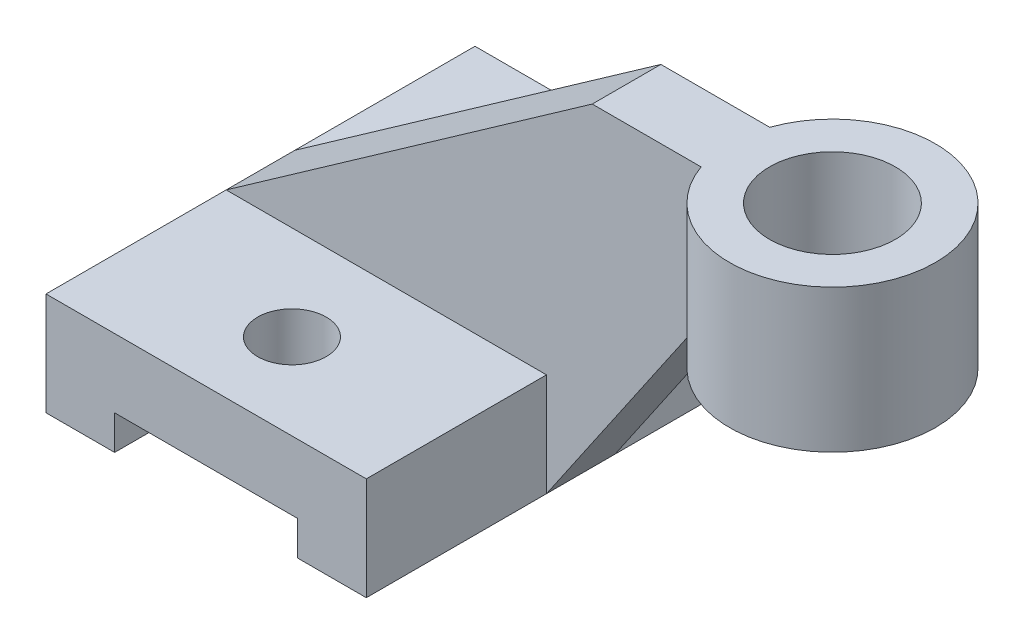
ISO-10303-21;
HEADER;
FILE_DESCRIPTION(('STEP AP214'),'2;1');
FILE_NAME('part.step','',(''),(''),'','','');
FILE_SCHEMA(('AUTOMOTIVE_DESIGN { 1 0 10303 214 1 1 1 1 }'));
ENDSEC;
DATA;
#1=APPLICATION_CONTEXT('core data for automotive mechanical design processes');
#2=APPLICATION_PROTOCOL_DEFINITION('international standard','automotive_design',2000,#1);
#3=PRODUCT_CONTEXT('',#1,'mechanical');
#4=PRODUCT('Part','Part','',(#3));
#5=PRODUCT_RELATED_PRODUCT_CATEGORY('part','',(#4));
#6=PRODUCT_DEFINITION_FORMATION('','',#4);
#7=PRODUCT_DEFINITION_CONTEXT('part definition',#1,'design');
#8=PRODUCT_DEFINITION('design','',#6,#7);
#9=PRODUCT_DEFINITION_SHAPE('','',#8);
#10=(LENGTH_UNIT() NAMED_UNIT(*) SI_UNIT(.MILLI.,.METRE.));
#11=(NAMED_UNIT(*) PLANE_ANGLE_UNIT() SI_UNIT($,.RADIAN.));
#12=(NAMED_UNIT(*) SI_UNIT($,.STERADIAN.) SOLID_ANGLE_UNIT());
#13=UNCERTAINTY_MEASURE_WITH_UNIT(LENGTH_MEASURE(1.E-05),#10,'distance_accuracy_value','');
#14=(GEOMETRIC_REPRESENTATION_CONTEXT(3) GLOBAL_UNCERTAINTY_ASSIGNED_CONTEXT((#13)) GLOBAL_UNIT_ASSIGNED_CONTEXT((#10,
#11,#12)) REPRESENTATION_CONTEXT('',''));
#15=CARTESIAN_POINT('',(0.,0.,0.));
#16=DIRECTION('',(0.,0.,1.));
#17=DIRECTION('',(1.,0.,0.));
#18=AXIS2_PLACEMENT_3D('',#15,#16,#17);
#19=CARTESIAN_POINT('',(56.,18.,-75.));
#20=DIRECTION('',(0.,1.,0.));
#21=DIRECTION('',(-1.,0.,0.));
#22=AXIS2_PLACEMENT_3D('',#19,#20,#21);
#23=PLANE('',#22);
#24=CARTESIAN_POINT('',(28.,18.,-60.));
#25=DIRECTION('',(0.,1.,0.));
#26=DIRECTION('',(-1.,0.,0.));
#27=AXIS2_PLACEMENT_3D('',#24,#25,#26);
#28=CIRCLE('',#27,6.);
#29=CARTESIAN_POINT('',(22.,18.,-60.));
#30=VERTEX_POINT('',#29);
#31=EDGE_CURVE('E217',#30,#30,#28,.T.);
#32=ORIENTED_EDGE('',*,*,#31,.F.);
#33=EDGE_LOOP('',(#32));
#34=FACE_BOUND('',#33,.T.);
#35=DIRECTION('',(0.,0.,1.));
#36=VECTOR('',#35,1.);
#37=CARTESIAN_POINT('',(0.,18.,-75.));
#38=LINE('',#37,#36);
#39=CARTESIAN_POINT('',(0.,18.,-75.));
#40=VERTEX_POINT('',#39);
#41=CARTESIAN_POINT('',(0.,18.,-43.5));
#42=VERTEX_POINT('',#41);
#43=EDGE_CURVE('E54',#40,#42,#38,.T.);
#44=ORIENTED_EDGE('',*,*,#43,.T.);
#45=DIRECTION('',(1.,0.,0.));
#46=VECTOR('',#45,1.);
#47=CARTESIAN_POINT('',(56.,18.,-43.5));
#48=LINE('',#47,#46);
#49=CARTESIAN_POINT('',(56.,18.,-43.5));
#50=VERTEX_POINT('',#49);
#51=EDGE_CURVE('E168',#42,#50,#48,.T.);
#52=ORIENTED_EDGE('',*,*,#51,.T.);
#53=DIRECTION('',(0.,0.,1.));
#54=VECTOR('',#53,1.);
#55=CARTESIAN_POINT('',(56.,18.,-75.));
#56=LINE('',#55,#54);
#57=CARTESIAN_POINT('',(56.,18.,-75.));
#58=VERTEX_POINT('',#57);
#59=EDGE_CURVE('E296',#58,#50,#56,.T.);
#60=ORIENTED_EDGE('',*,*,#59,.F.);
#61=DIRECTION('',(-1.,0.,0.));
#62=VECTOR('',#61,1.);
#63=CARTESIAN_POINT('',(56.,18.,-75.));
#64=LINE('',#63,#62);
#65=EDGE_CURVE('E255',#58,#40,#64,.T.);
#66=ORIENTED_EDGE('',*,*,#65,.T.);
#67=EDGE_LOOP('',(#44,#52,#60,#66));
#68=FACE_BOUND('',#67,.T.);
#69=ADVANCED_FACE('F45',(#34,#68),#23,.T.);
#70=CARTESIAN_POINT('',(56.,0.,-75.));
#71=DIRECTION('',(1.,0.,0.));
#72=DIRECTION('',(0.,0.,-1.));
#73=AXIS2_PLACEMENT_3D('',#70,#71,#72);
#74=PLANE('',#73);
#75=ORIENTED_EDGE('',*,*,#59,.T.);
#76=DIRECTION('',(0.,-1.,0.));
#77=VECTOR('',#76,1.);
#78=CARTESIAN_POINT('',(56.,0.,-43.5));
#79=LINE('',#78,#77);
#80=CARTESIAN_POINT('',(56.,0.,-43.5));
#81=VERTEX_POINT('',#80);
#82=EDGE_CURVE('E187',#50,#81,#79,.T.);
#83=ORIENTED_EDGE('',*,*,#82,.T.);
#84=DIRECTION('',(0.,0.,1.));
#85=VECTOR('',#84,1.);
#86=CARTESIAN_POINT('',(56.,0.,-75.));
#87=LINE('',#86,#85);
#88=CARTESIAN_POINT('',(56.,0.,-75.));
#89=VERTEX_POINT('',#88);
#90=EDGE_CURVE('E301',#89,#81,#87,.T.);
#91=ORIENTED_EDGE('',*,*,#90,.F.);
#92=DIRECTION('',(0.,1.,0.));
#93=VECTOR('',#92,1.);
#94=CARTESIAN_POINT('',(56.,0.,-75.));
#95=LINE('',#94,#93);
#96=EDGE_CURVE('E251',#89,#58,#95,.T.);
#97=ORIENTED_EDGE('',*,*,#96,.T.);
#98=EDGE_LOOP('',(#75,#83,#91,#97));
#99=FACE_BOUND('',#98,.T.);
#100=ADVANCED_FACE('F361',(#99),#74,.T.);
#101=CARTESIAN_POINT('',(0.,18.,-75.));
#102=DIRECTION('',(-1.,0.,0.));
#103=DIRECTION('',(0.,-1.,0.));
#104=AXIS2_PLACEMENT_3D('',#101,#102,#103);
#105=PLANE('',#104);
#106=DIRECTION('',(0.,-1.,0.));
#107=VECTOR('',#106,1.);
#108=CARTESIAN_POINT('',(0.,18.,0.));
#109=LINE('',#108,#107);
#110=CARTESIAN_POINT('',(0.,18.,0.));
#111=VERTEX_POINT('',#110);
#112=CARTESIAN_POINT('',(0.,0.,0.));
#113=VERTEX_POINT('',#112);
#114=EDGE_CURVE('E260',#111,#113,#109,.T.);
#115=ORIENTED_EDGE('',*,*,#114,.F.);
#116=CARTESIAN_POINT('',(0.,18.,-31.5));
#117=VERTEX_POINT('',#116);
#118=EDGE_CURVE('E295',#117,#111,#38,.T.);
#119=ORIENTED_EDGE('',*,*,#118,.F.);
#120=DIRECTION('',(0.,0.,-1.));
#121=VECTOR('',#120,1.);
#122=CARTESIAN_POINT('',(0.,18.,-31.5));
#123=LINE('',#122,#121);
#124=EDGE_CURVE('E179',#117,#42,#123,.T.);
#125=ORIENTED_EDGE('',*,*,#124,.T.);
#126=ORIENTED_EDGE('',*,*,#43,.F.);
#127=DIRECTION('',(0.,-1.,0.));
#128=VECTOR('',#127,1.);
#129=CARTESIAN_POINT('',(0.,18.,-75.));
#130=LINE('',#129,#128);
#131=CARTESIAN_POINT('',(0.,0.,-75.));
#132=VERTEX_POINT('',#131);
#133=EDGE_CURVE('E226',#40,#132,#130,.T.);
#134=ORIENTED_EDGE('',*,*,#133,.T.);
#135=DIRECTION('',(0.,0.,1.));
#136=VECTOR('',#135,1.);
#137=CARTESIAN_POINT('',(0.,0.,-75.));
#138=LINE('',#137,#136);
#139=EDGE_CURVE('E259',#132,#113,#138,.T.);
#140=ORIENTED_EDGE('',*,*,#139,.T.);
#141=EDGE_LOOP('',(#115,#119,#125,#126,#134,#140));
#142=FACE_BOUND('',#141,.T.);
#143=ADVANCED_FACE('F47',(#142),#105,.T.);
#144=DIRECTION('',(1.,0.,0.));
#145=VECTOR('',#144,1.);
#146=CARTESIAN_POINT('',(56.,18.,-31.5));
#147=LINE('',#146,#145);
#148=CARTESIAN_POINT('',(56.,18.,-31.5));
#149=VERTEX_POINT('',#148);
#150=EDGE_CURVE('E205',#117,#149,#147,.T.);
#151=ORIENTED_EDGE('',*,*,#150,.F.);
#152=ORIENTED_EDGE('',*,*,#118,.T.);
#153=DIRECTION('',(-1.,0.,0.));
#154=VECTOR('',#153,1.);
#155=CARTESIAN_POINT('',(56.,18.,0.));
#156=LINE('',#155,#154);
#157=CARTESIAN_POINT('',(56.,18.,0.));
#158=VERTEX_POINT('',#157);
#159=EDGE_CURVE('E231',#158,#111,#156,.T.);
#160=ORIENTED_EDGE('',*,*,#159,.F.);
#161=EDGE_CURVE('E300',#149,#158,#56,.T.);
#162=ORIENTED_EDGE('',*,*,#161,.F.);
#163=EDGE_LOOP('',(#151,#152,#160,#162));
#164=FACE_BOUND('',#163,.T.);
#165=CARTESIAN_POINT('',(28.,18.,-15.));
#166=DIRECTION('',(0.,1.,0.));
#167=DIRECTION('',(-1.,0.,0.));
#168=AXIS2_PLACEMENT_3D('',#165,#166,#167);
#169=CIRCLE('',#168,6.);
#170=CARTESIAN_POINT('',(22.,18.,-15.));
#171=VERTEX_POINT('',#170);
#172=EDGE_CURVE('E218',#171,#171,#169,.T.);
#173=ORIENTED_EDGE('',*,*,#172,.F.);
#174=EDGE_LOOP('',(#173));
#175=FACE_BOUND('',#174,.T.);
#176=ADVANCED_FACE('F375',(#164,#175),#23,.T.);
#177=DIRECTION('',(0.,-1.,0.));
#178=VECTOR('',#177,1.);
#179=CARTESIAN_POINT('',(56.,0.,-31.5));
#180=LINE('',#179,#178);
#181=CARTESIAN_POINT('',(56.,0.,-31.5));
#182=VERTEX_POINT('',#181);
#183=EDGE_CURVE('E382',#149,#182,#180,.T.);
#184=ORIENTED_EDGE('',*,*,#183,.F.);
#185=ORIENTED_EDGE('',*,*,#161,.T.);
#186=DIRECTION('',(0.,1.,0.));
#187=VECTOR('',#186,1.);
#188=CARTESIAN_POINT('',(56.,0.,0.));
#189=LINE('',#188,#187);
#190=CARTESIAN_POINT('',(56.,0.,0.));
#191=VERTEX_POINT('',#190);
#192=EDGE_CURVE('E285',#191,#158,#189,.T.);
#193=ORIENTED_EDGE('',*,*,#192,.F.);
#194=EDGE_CURVE('E305',#182,#191,#87,.T.);
#195=ORIENTED_EDGE('',*,*,#194,.F.);
#196=EDGE_LOOP('',(#184,#185,#193,#195));
#197=FACE_BOUND('',#196,.T.);
#198=ADVANCED_FACE('F381',(#197),#74,.T.);
#199=CARTESIAN_POINT('',(44.,0.,-75.));
#200=DIRECTION('',(0.,-1.,0.));
#201=DIRECTION('',(0.,0.,-1.));
#202=AXIS2_PLACEMENT_3D('',#199,#200,#201);
#203=PLANE('',#202);
#204=DIRECTION('',(1.,0.,0.));
#205=VECTOR('',#204,1.);
#206=CARTESIAN_POINT('',(44.,0.,0.));
#207=LINE('',#206,#205);
#208=CARTESIAN_POINT('',(44.,0.,0.));
#209=VERTEX_POINT('',#208);
#210=EDGE_CURVE('E281',#209,#191,#207,.T.);
#211=ORIENTED_EDGE('',*,*,#210,.F.);
#212=DIRECTION('',(0.,0.,1.));
#213=VECTOR('',#212,1.);
#214=CARTESIAN_POINT('',(44.,0.,-75.));
#215=LINE('',#214,#213);
#216=CARTESIAN_POINT('',(44.,0.,-75.));
#217=VERTEX_POINT('',#216);
#218=EDGE_CURVE('E306',#217,#209,#215,.T.);
#219=ORIENTED_EDGE('',*,*,#218,.F.);
#220=DIRECTION('',(1.,0.,0.));
#221=VECTOR('',#220,1.);
#222=CARTESIAN_POINT('',(44.,0.,-75.));
#223=LINE('',#222,#221);
#224=EDGE_CURVE('E247',#217,#89,#223,.T.);
#225=ORIENTED_EDGE('',*,*,#224,.T.);
#226=ORIENTED_EDGE('',*,*,#90,.T.);
#227=DIRECTION('',(0.,0.,-1.));
#228=VECTOR('',#227,1.);
#229=CARTESIAN_POINT('',(56.,0.,-31.5));
#230=LINE('',#229,#228);
#231=EDGE_CURVE('E214',#182,#81,#230,.T.);
#232=ORIENTED_EDGE('',*,*,#231,.F.);
#233=ORIENTED_EDGE('',*,*,#194,.T.);
#234=EDGE_LOOP('',(#211,#219,#225,#226,#232,#233));
#235=FACE_BOUND('',#234,.T.);
#236=ADVANCED_FACE('F365',(#235),#203,.T.);
#237=CARTESIAN_POINT('',(44.,6.,-75.));
#238=DIRECTION('',(-1.,0.,0.));
#239=DIRECTION('',(0.,0.,1.));
#240=AXIS2_PLACEMENT_3D('',#237,#238,#239);
#241=PLANE('',#240);
#242=DIRECTION('',(0.,-1.,0.));
#243=VECTOR('',#242,1.);
#244=CARTESIAN_POINT('',(44.,6.,0.));
#245=LINE('',#244,#243);
#246=CARTESIAN_POINT('',(44.,6.,0.));
#247=VERTEX_POINT('',#246);
#248=EDGE_CURVE('E277',#247,#209,#245,.T.);
#249=ORIENTED_EDGE('',*,*,#248,.F.);
#250=DIRECTION('',(0.,0.,1.));
#251=VECTOR('',#250,1.);
#252=CARTESIAN_POINT('',(44.,6.,-75.));
#253=LINE('',#252,#251);
#254=CARTESIAN_POINT('',(44.,6.,-75.));
#255=VERTEX_POINT('',#254);
#256=EDGE_CURVE('E309',#255,#247,#253,.T.);
#257=ORIENTED_EDGE('',*,*,#256,.F.);
#258=DIRECTION('',(0.,-1.,0.));
#259=VECTOR('',#258,1.);
#260=CARTESIAN_POINT('',(44.,6.,-75.));
#261=LINE('',#260,#259);
#262=EDGE_CURVE('E243',#255,#217,#261,.T.);
#263=ORIENTED_EDGE('',*,*,#262,.T.);
#264=ORIENTED_EDGE('',*,*,#218,.T.);
#265=EDGE_LOOP('',(#249,#257,#263,#264));
#266=FACE_BOUND('',#265,.T.);
#267=ADVANCED_FACE('F333',(#266),#241,.T.);
#268=CARTESIAN_POINT('',(12.,6.,-75.));
#269=DIRECTION('',(0.,-1.,0.));
#270=DIRECTION('',(0.,0.,-1.));
#271=AXIS2_PLACEMENT_3D('',#268,#269,#270);
#272=PLANE('',#271);
#273=CARTESIAN_POINT('',(28.,6.,-15.));
#274=DIRECTION('',(0.,-1.,0.));
#275=DIRECTION('',(0.,0.,-1.));
#276=AXIS2_PLACEMENT_3D('',#273,#274,#275);
#277=CIRCLE('',#276,6.);
#278=CARTESIAN_POINT('',(28.,6.,-21.));
#279=VERTEX_POINT('',#278);
#280=EDGE_CURVE('E265',#279,#279,#277,.T.);
#281=ORIENTED_EDGE('',*,*,#280,.F.);
#282=EDGE_LOOP('',(#281));
#283=FACE_BOUND('',#282,.T.);
#284=CARTESIAN_POINT('',(28.,6.,-60.));
#285=DIRECTION('',(0.,-1.,0.));
#286=DIRECTION('',(0.,0.,-1.));
#287=AXIS2_PLACEMENT_3D('',#284,#285,#286);
#288=CIRCLE('',#287,6.);
#289=CARTESIAN_POINT('',(28.,6.,-66.));
#290=VERTEX_POINT('',#289);
#291=EDGE_CURVE('E222',#290,#290,#288,.T.);
#292=ORIENTED_EDGE('',*,*,#291,.F.);
#293=EDGE_LOOP('',(#292));
#294=FACE_BOUND('',#293,.T.);
#295=DIRECTION('',(1.,0.,0.));
#296=VECTOR('',#295,1.);
#297=CARTESIAN_POINT('',(12.,6.,0.));
#298=LINE('',#297,#296);
#299=CARTESIAN_POINT('',(12.,6.,0.));
#300=VERTEX_POINT('',#299);
#301=EDGE_CURVE('E273',#300,#247,#298,.T.);
#302=ORIENTED_EDGE('',*,*,#301,.F.);
#303=DIRECTION('',(0.,0.,1.));
#304=VECTOR('',#303,1.);
#305=CARTESIAN_POINT('',(12.,6.,-75.));
#306=LINE('',#305,#304);
#307=CARTESIAN_POINT('',(12.,6.,-75.));
#308=VERTEX_POINT('',#307);
#309=EDGE_CURVE('E312',#308,#300,#306,.T.);
#310=ORIENTED_EDGE('',*,*,#309,.F.);
#311=DIRECTION('',(1.,0.,0.));
#312=VECTOR('',#311,1.);
#313=CARTESIAN_POINT('',(12.,6.,-75.));
#314=LINE('',#313,#312);
#315=EDGE_CURVE('E239',#308,#255,#314,.T.);
#316=ORIENTED_EDGE('',*,*,#315,.T.);
#317=ORIENTED_EDGE('',*,*,#256,.T.);
#318=EDGE_LOOP('',(#302,#310,#316,#317));
#319=FACE_BOUND('',#318,.T.);
#320=ADVANCED_FACE('F329',(#283,#294,#319),#272,.T.);
#321=CARTESIAN_POINT('',(12.,0.,-75.));
#322=DIRECTION('',(1.,0.,0.));
#323=DIRECTION('',(0.,0.,-1.));
#324=AXIS2_PLACEMENT_3D('',#321,#322,#323);
#325=PLANE('',#324);
#326=DIRECTION('',(0.,1.,0.));
#327=VECTOR('',#326,1.);
#328=CARTESIAN_POINT('',(12.,0.,0.));
#329=LINE('',#328,#327);
#330=CARTESIAN_POINT('',(12.,0.,0.));
#331=VERTEX_POINT('',#330);
#332=EDGE_CURVE('E269',#331,#300,#329,.T.);
#333=ORIENTED_EDGE('',*,*,#332,.F.);
#334=DIRECTION('',(0.,0.,1.));
#335=VECTOR('',#334,1.);
#336=CARTESIAN_POINT('',(12.,0.,-75.));
#337=LINE('',#336,#335);
#338=CARTESIAN_POINT('',(12.,0.,-75.));
#339=VERTEX_POINT('',#338);
#340=EDGE_CURVE('E315',#339,#331,#337,.T.);
#341=ORIENTED_EDGE('',*,*,#340,.F.);
#342=DIRECTION('',(0.,1.,0.));
#343=VECTOR('',#342,1.);
#344=CARTESIAN_POINT('',(12.,0.,-75.));
#345=LINE('',#344,#343);
#346=EDGE_CURVE('E235',#339,#308,#345,.T.);
#347=ORIENTED_EDGE('',*,*,#346,.T.);
#348=ORIENTED_EDGE('',*,*,#309,.T.);
#349=EDGE_LOOP('',(#333,#341,#347,#348));
#350=FACE_BOUND('',#349,.T.);
#351=ADVANCED_FACE('F332',(#350),#325,.T.);
#352=CARTESIAN_POINT('',(0.,0.,-75.));
#353=DIRECTION('',(0.,-1.,0.));
#354=DIRECTION('',(0.,0.,-1.));
#355=AXIS2_PLACEMENT_3D('',#352,#353,#354);
#356=PLANE('',#355);
#357=DIRECTION('',(1.,0.,0.));
#358=VECTOR('',#357,1.);
#359=CARTESIAN_POINT('',(0.,0.,0.));
#360=LINE('',#359,#358);
#361=EDGE_CURVE('E264',#113,#331,#360,.T.);
#362=ORIENTED_EDGE('',*,*,#361,.F.);
#363=ORIENTED_EDGE('',*,*,#139,.F.);
#364=DIRECTION('',(1.,0.,0.));
#365=VECTOR('',#364,1.);
#366=CARTESIAN_POINT('',(0.,0.,-75.));
#367=LINE('',#366,#365);
#368=EDGE_CURVE('E230',#132,#339,#367,.T.);
#369=ORIENTED_EDGE('',*,*,#368,.T.);
#370=ORIENTED_EDGE('',*,*,#340,.T.);
#371=EDGE_LOOP('',(#362,#363,#369,#370));
#372=FACE_BOUND('',#371,.T.);
#373=ADVANCED_FACE('F352',(#372),#356,.T.);
#374=CARTESIAN_POINT('',(0.,0.,-75.));
#375=DIRECTION('',(0.,0.,1.));
#376=DIRECTION('',(1.,0.,0.));
#377=AXIS2_PLACEMENT_3D('',#374,#375,#376);
#378=PLANE('',#377);
#379=ORIENTED_EDGE('',*,*,#133,.F.);
#380=ORIENTED_EDGE('',*,*,#65,.F.);
#381=ORIENTED_EDGE('',*,*,#96,.F.);
#382=ORIENTED_EDGE('',*,*,#224,.F.);
#383=ORIENTED_EDGE('',*,*,#262,.F.);
#384=ORIENTED_EDGE('',*,*,#315,.F.);
#385=ORIENTED_EDGE('',*,*,#346,.F.);
#386=ORIENTED_EDGE('',*,*,#368,.F.);
#387=EDGE_LOOP('',(#379,#380,#381,#382,#383,#384,#385,#386));
#388=FACE_BOUND('',#387,.T.);
#389=ADVANCED_FACE('F349',(#388),#378,.F.);
#390=CARTESIAN_POINT('',(0.,0.,0.));
#391=DIRECTION('',(0.,0.,1.));
#392=DIRECTION('',(1.,0.,0.));
#393=AXIS2_PLACEMENT_3D('',#390,#391,#392);
#394=PLANE('',#393);
#395=ORIENTED_EDGE('',*,*,#114,.T.);
#396=ORIENTED_EDGE('',*,*,#361,.T.);
#397=ORIENTED_EDGE('',*,*,#332,.T.);
#398=ORIENTED_EDGE('',*,*,#301,.T.);
#399=ORIENTED_EDGE('',*,*,#248,.T.);
#400=ORIENTED_EDGE('',*,*,#210,.T.);
#401=ORIENTED_EDGE('',*,*,#192,.T.);
#402=ORIENTED_EDGE('',*,*,#159,.T.);
#403=EDGE_LOOP('',(#395,#396,#397,#398,#399,#400,#401,#402));
#404=FACE_BOUND('',#403,.T.);
#405=ADVANCED_FACE('F342',(#404),#394,.T.);
#406=CARTESIAN_POINT('',(28.,0.,-60.));
#407=DIRECTION('',(0.,1.,0.));
#408=DIRECTION('',(-1.,0.,0.));
#409=AXIS2_PLACEMENT_3D('',#406,#407,#408);
#410=CYLINDRICAL_SURFACE('',#409,6.);
#411=ORIENTED_EDGE('',*,*,#291,.T.);
#412=EDGE_LOOP('',(#411));
#413=FACE_BOUND('',#412,.T.);
#414=ORIENTED_EDGE('',*,*,#31,.T.);
#415=EDGE_LOOP('',(#414));
#416=FACE_BOUND('',#415,.T.);
#417=ADVANCED_FACE('F568',(#413,#416),#410,.F.);
#418=CARTESIAN_POINT('',(28.,0.,-15.));
#419=DIRECTION('',(0.,1.,0.));
#420=DIRECTION('',(-1.,0.,0.));
#421=AXIS2_PLACEMENT_3D('',#418,#419,#420);
#422=CYLINDRICAL_SURFACE('',#421,6.);
#423=ORIENTED_EDGE('',*,*,#280,.T.);
#424=EDGE_LOOP('',(#423));
#425=FACE_BOUND('',#424,.T.);
#426=ORIENTED_EDGE('',*,*,#172,.T.);
#427=EDGE_LOOP('',(#426));
#428=FACE_BOUND('',#427,.T.);
#429=ADVANCED_FACE('F326',(#425,#428),#422,.F.);
#430=CARTESIAN_POINT('',(82.,38.,-31.5));
#431=DIRECTION('',(-0.825307261249832,0.564683915591991,0.));
#432=DIRECTION('',(-0.564683915591991,-0.825307261249832,0.));
#433=AXIS2_PLACEMENT_3D('',#430,#431,#432);
#434=PLANE('',#433);
#435=DIRECTION('',(0.564683915591991,0.825307261249831,0.));
#436=VECTOR('',#435,1.);
#437=CARTESIAN_POINT('',(82.,38.,-43.5));
#438=LINE('',#437,#436);
#439=CARTESIAN_POINT('',(82.,38.,-43.5));
#440=VERTEX_POINT('',#439);
#441=EDGE_CURVE('E191',#81,#440,#438,.T.);
#442=ORIENTED_EDGE('',*,*,#441,.T.);
#443=DIRECTION('',(0.,0.,-1.));
#444=VECTOR('',#443,1.);
#445=CARTESIAN_POINT('',(82.,38.,-31.5));
#446=LINE('',#445,#444);
#447=CARTESIAN_POINT('',(82.,38.,-31.5));
#448=VERTEX_POINT('',#447);
#449=EDGE_CURVE('E211',#448,#440,#446,.T.);
#450=ORIENTED_EDGE('',*,*,#449,.F.);
#451=DIRECTION('',(0.564683915591991,0.825307261249831,0.));
#452=VECTOR('',#451,1.);
#453=CARTESIAN_POINT('',(82.,38.,-31.5));
#454=LINE('',#453,#452);
#455=EDGE_CURVE('E69',#182,#448,#454,.T.);
#456=ORIENTED_EDGE('',*,*,#455,.F.);
#457=ORIENTED_EDGE('',*,*,#231,.T.);
#458=EDGE_LOOP('',(#442,#450,#456,#457));
#459=FACE_BOUND('',#458,.T.);
#460=ADVANCED_FACE('F413',(#459),#434,.F.);
#461=CARTESIAN_POINT('',(100.,38.,-31.5));
#462=DIRECTION('',(0.,1.,0.));
#463=DIRECTION('',(-1.,0.,0.));
#464=AXIS2_PLACEMENT_3D('',#461,#462,#463);
#465=PLANE('',#464);
#466=CARTESIAN_POINT('',(100.,38.,-37.5));
#467=DIRECTION('',(0.,1.,0.));
#468=DIRECTION('',(-1.,0.,0.));
#469=AXIS2_PLACEMENT_3D('',#466,#467,#468);
#470=CIRCLE('',#469,11.);
#471=CARTESIAN_POINT('',(89.,38.,-37.5));
#472=VERTEX_POINT('',#471);
#473=EDGE_CURVE('E158',#472,#472,#470,.T.);
#474=ORIENTED_EDGE('',*,*,#473,.T.);
#475=EDGE_LOOP('',(#474));
#476=FACE_BOUND('',#475,.T.);
#477=DIRECTION('',(1.,0.,0.));
#478=VECTOR('',#477,1.);
#479=CARTESIAN_POINT('',(100.,38.,-43.5));
#480=LINE('',#479,#478);
#481=CARTESIAN_POINT('',(83.0294372515228,38.,-43.5));
#482=VERTEX_POINT('',#481);
#483=EDGE_CURVE('E195',#440,#482,#480,.T.);
#484=ORIENTED_EDGE('',*,*,#483,.T.);
#485=CARTESIAN_POINT('',(100.,38.,-37.5));
#486=DIRECTION('',(0.,1.,0.));
#487=DIRECTION('',(0.,0.,1.));
#488=AXIS2_PLACEMENT_3D('',#485,#486,#487);
#489=CIRCLE('',#488,18.);
#490=CARTESIAN_POINT('',(83.0294372515228,38.,-31.5));
#491=VERTEX_POINT('',#490);
#492=EDGE_CURVE('E157',#491,#482,#489,.T.);
#493=ORIENTED_EDGE('',*,*,#492,.F.);
#494=DIRECTION('',(1.,0.,0.));
#495=VECTOR('',#494,1.);
#496=CARTESIAN_POINT('',(100.,38.,-31.5));
#497=LINE('',#496,#495);
#498=EDGE_CURVE('E166',#448,#491,#497,.T.);
#499=ORIENTED_EDGE('',*,*,#498,.F.);
#500=ORIENTED_EDGE('',*,*,#449,.T.);
#501=EDGE_LOOP('',(#484,#493,#499,#500));
#502=FACE_BOUND('',#501,.T.);
#503=ADVANCED_FACE('F404',(#476,#502),#465,.F.);
#504=CARTESIAN_POINT('',(64.,63.,-31.5));
#505=DIRECTION('',(0.,-1.,0.));
#506=DIRECTION('',(0.,0.,-1.));
#507=AXIS2_PLACEMENT_3D('',#504,#505,#506);
#508=PLANE('',#507);
#509=CARTESIAN_POINT('',(100.,63.,-37.5));
#510=DIRECTION('',(0.,1.,0.));
#511=DIRECTION('',(0.,0.,1.));
#512=AXIS2_PLACEMENT_3D('',#509,#510,#511);
#513=CIRCLE('',#512,11.);
#514=CARTESIAN_POINT('',(100.,63.,-26.5));
#515=VERTEX_POINT('',#514);
#516=EDGE_CURVE('E394',#515,#515,#513,.T.);
#517=ORIENTED_EDGE('',*,*,#516,.F.);
#518=EDGE_LOOP('',(#517));
#519=FACE_BOUND('',#518,.T.);
#520=DIRECTION('',(-1.,0.,0.));
#521=VECTOR('',#520,1.);
#522=CARTESIAN_POINT('',(64.,63.,-31.5));
#523=LINE('',#522,#521);
#524=CARTESIAN_POINT('',(83.0294372515228,63.,-31.5));
#525=VERTEX_POINT('',#524);
#526=CARTESIAN_POINT('',(64.,63.,-31.5));
#527=VERTEX_POINT('',#526);
#528=EDGE_CURVE('E163',#525,#527,#523,.T.);
#529=ORIENTED_EDGE('',*,*,#528,.F.);
#530=CARTESIAN_POINT('',(100.,63.,-37.5));
#531=DIRECTION('',(0.,1.,0.));
#532=DIRECTION('',(0.,0.,1.));
#533=AXIS2_PLACEMENT_3D('',#530,#531,#532);
#534=CIRCLE('',#533,18.);
#535=CARTESIAN_POINT('',(83.0294372515228,63.,-43.5));
#536=VERTEX_POINT('',#535);
#537=EDGE_CURVE('E61',#525,#536,#534,.T.);
#538=ORIENTED_EDGE('',*,*,#537,.T.);
#539=DIRECTION('',(-1.,0.,0.));
#540=VECTOR('',#539,1.);
#541=CARTESIAN_POINT('',(64.,63.,-43.5));
#542=LINE('',#541,#540);
#543=CARTESIAN_POINT('',(64.,63.,-43.5));
#544=VERTEX_POINT('',#543);
#545=EDGE_CURVE('E199',#536,#544,#542,.T.);
#546=ORIENTED_EDGE('',*,*,#545,.T.);
#547=DIRECTION('',(0.,0.,-1.));
#548=VECTOR('',#547,1.);
#549=CARTESIAN_POINT('',(64.,63.,-31.5));
#550=LINE('',#549,#548);
#551=EDGE_CURVE('E172',#527,#544,#550,.T.);
#552=ORIENTED_EDGE('',*,*,#551,.F.);
#553=EDGE_LOOP('',(#529,#538,#546,#552));
#554=FACE_BOUND('',#553,.T.);
#555=ADVANCED_FACE('F170',(#519,#554),#508,.F.);
#556=CARTESIAN_POINT('',(0.,18.,-31.5));
#557=DIRECTION('',(0.575176751990256,-0.818029158386142,0.));
#558=DIRECTION('',(0.818029158386142,0.575176751990256,0.));
#559=AXIS2_PLACEMENT_3D('',#556,#557,#558);
#560=PLANE('',#559);
#561=DIRECTION('',(-0.818029158386142,-0.575176751990256,0.));
#562=VECTOR('',#561,1.);
#563=CARTESIAN_POINT('',(0.,18.,-43.5));
#564=LINE('',#563,#562);
#565=EDGE_CURVE('E202',#544,#42,#564,.T.);
#566=ORIENTED_EDGE('',*,*,#565,.T.);
#567=ORIENTED_EDGE('',*,*,#124,.F.);
#568=DIRECTION('',(-0.818029158386142,-0.575176751990256,0.));
#569=VECTOR('',#568,1.);
#570=CARTESIAN_POINT('',(0.,18.,-31.5));
#571=LINE('',#570,#569);
#572=EDGE_CURVE('E175',#527,#117,#571,.T.);
#573=ORIENTED_EDGE('',*,*,#572,.F.);
#574=ORIENTED_EDGE('',*,*,#551,.T.);
#575=EDGE_LOOP('',(#566,#567,#573,#574));
#576=FACE_BOUND('',#575,.T.);
#577=ADVANCED_FACE('F403',(#576),#560,.F.);
#578=CARTESIAN_POINT('',(0.,0.,-31.5));
#579=DIRECTION('',(0.,0.,1.));
#580=DIRECTION('',(1.,0.,0.));
#581=AXIS2_PLACEMENT_3D('',#578,#579,#580);
#582=PLANE('',#581);
#583=DIRECTION('',(0.,1.,0.));
#584=VECTOR('',#583,1.);
#585=CARTESIAN_POINT('',(83.0294372515228,38.,-31.5));
#586=LINE('',#585,#584);
#587=EDGE_CURVE('E153',#525,#491,#586,.F.);
#588=ORIENTED_EDGE('',*,*,#587,.F.);
#589=ORIENTED_EDGE('',*,*,#528,.T.);
#590=ORIENTED_EDGE('',*,*,#572,.T.);
#591=ORIENTED_EDGE('',*,*,#150,.T.);
#592=ORIENTED_EDGE('',*,*,#183,.T.);
#593=ORIENTED_EDGE('',*,*,#455,.T.);
#594=ORIENTED_EDGE('',*,*,#498,.T.);
#595=EDGE_LOOP('',(#588,#589,#590,#591,#592,#593,#594));
#596=FACE_BOUND('',#595,.T.);
#597=ADVANCED_FACE('F162',(#596),#582,.T.);
#598=CARTESIAN_POINT('',(0.,0.,-43.5));
#599=DIRECTION('',(0.,0.,1.));
#600=DIRECTION('',(1.,0.,0.));
#601=AXIS2_PLACEMENT_3D('',#598,#599,#600);
#602=PLANE('',#601);
#603=ORIENTED_EDGE('',*,*,#545,.F.);
#604=DIRECTION('',(0.,1.,0.));
#605=VECTOR('',#604,1.);
#606=CARTESIAN_POINT('',(83.0294372515228,38.,-43.5));
#607=LINE('',#606,#605);
#608=EDGE_CURVE('E11',#536,#482,#607,.F.);
#609=ORIENTED_EDGE('',*,*,#608,.T.);
#610=ORIENTED_EDGE('',*,*,#483,.F.);
#611=ORIENTED_EDGE('',*,*,#441,.F.);
#612=ORIENTED_EDGE('',*,*,#82,.F.);
#613=ORIENTED_EDGE('',*,*,#51,.F.);
#614=ORIENTED_EDGE('',*,*,#565,.F.);
#615=EDGE_LOOP('',(#603,#609,#610,#611,#612,#613,#614));
#616=FACE_BOUND('',#615,.T.);
#617=ADVANCED_FACE('F478',(#616),#602,.F.);
#618=CARTESIAN_POINT('',(100.,38.,-37.5));
#619=DIRECTION('',(0.,1.,0.));
#620=DIRECTION('',(0.,0.,1.));
#621=AXIS2_PLACEMENT_3D('',#618,#619,#620);
#622=CYLINDRICAL_SURFACE('',#621,18.);
#623=ORIENTED_EDGE('',*,*,#537,.F.);
#624=ORIENTED_EDGE('',*,*,#587,.T.);
#625=ORIENTED_EDGE('',*,*,#492,.T.);
#626=ORIENTED_EDGE('',*,*,#608,.F.);
#627=EDGE_LOOP('',(#623,#624,#625,#626));
#628=FACE_BOUND('',#627,.T.);
#629=ADVANCED_FACE('F152',(#628),#622,.T.);
#630=CARTESIAN_POINT('',(100.,0.,-37.5));
#631=DIRECTION('',(0.,1.,0.));
#632=DIRECTION('',(0.,0.,1.));
#633=AXIS2_PLACEMENT_3D('',#630,#631,#632);
#634=CYLINDRICAL_SURFACE('',#633,11.);
#635=ORIENTED_EDGE('',*,*,#516,.T.);
#636=EDGE_LOOP('',(#635));
#637=FACE_BOUND('',#636,.T.);
#638=ORIENTED_EDGE('',*,*,#473,.F.);
#639=EDGE_LOOP('',(#638));
#640=FACE_BOUND('',#639,.T.);
#641=ADVANCED_FACE('F399',(#637,#640),#634,.F.);
#642=CLOSED_SHELL('',(#69,#100,#143,#176,#198,#236,#267,#320,#351,#373,#389,#405,#417,#429,#460,
#503,#555,#577,#597,#617,#629,#641));
#643=MANIFOLD_SOLID_BREP('B2',#642);
#644=ADVANCED_BREP_SHAPE_REPRESENTATION('',(#18,#643),#14);
#645=SHAPE_DEFINITION_REPRESENTATION(#9,#644);
ENDSEC;
END-ISO-10303-21;
